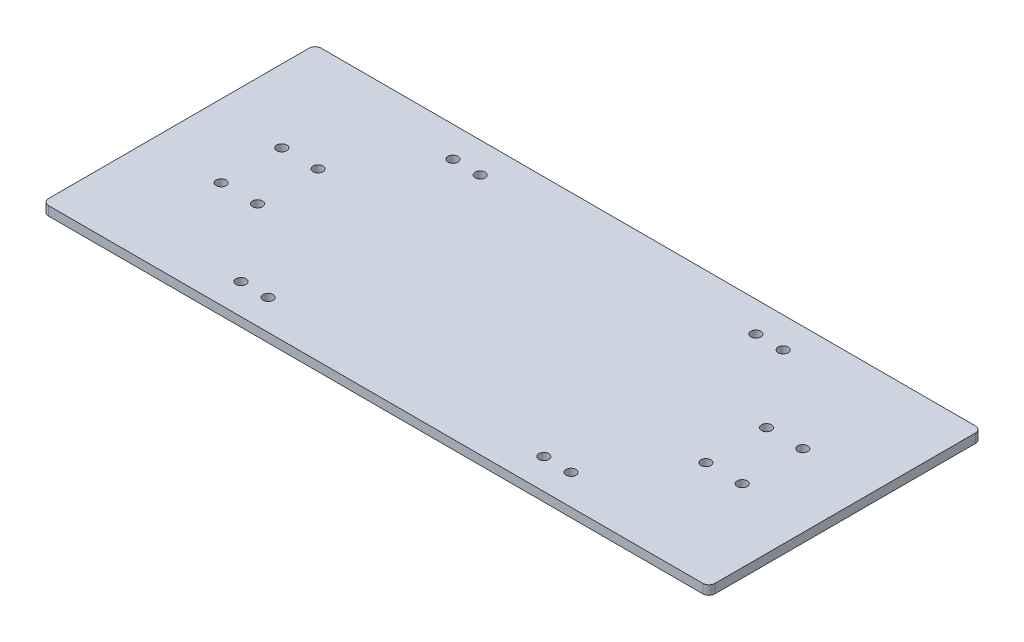
ISO-10303-21;
HEADER;
FILE_DESCRIPTION(('STEP AP214'),'2;1');
FILE_NAME('part.step','',(''),(''),'','','');
FILE_SCHEMA(('AUTOMOTIVE_DESIGN { 1 0 10303 214 1 1 1 1 }'));
ENDSEC;
DATA;
#1=APPLICATION_CONTEXT('core data for automotive mechanical design processes');
#2=APPLICATION_PROTOCOL_DEFINITION('international standard','automotive_design',2000,#1);
#3=PRODUCT_CONTEXT('',#1,'mechanical');
#4=PRODUCT('Part','Part','',(#3));
#5=PRODUCT_RELATED_PRODUCT_CATEGORY('part','',(#4));
#6=PRODUCT_DEFINITION_FORMATION('','',#4);
#7=PRODUCT_DEFINITION_CONTEXT('part definition',#1,'design');
#8=PRODUCT_DEFINITION('design','',#6,#7);
#9=PRODUCT_DEFINITION_SHAPE('','',#8);
#10=(LENGTH_UNIT() NAMED_UNIT(*) SI_UNIT(.MILLI.,.METRE.));
#11=(NAMED_UNIT(*) PLANE_ANGLE_UNIT() SI_UNIT($,.RADIAN.));
#12=(NAMED_UNIT(*) SI_UNIT($,.STERADIAN.) SOLID_ANGLE_UNIT());
#13=UNCERTAINTY_MEASURE_WITH_UNIT(LENGTH_MEASURE(1.E-05),#10,'distance_accuracy_value','');
#14=(GEOMETRIC_REPRESENTATION_CONTEXT(3) GLOBAL_UNCERTAINTY_ASSIGNED_CONTEXT((#13)) GLOBAL_UNIT_ASSIGNED_CONTEXT((#10,
#11,#12)) REPRESENTATION_CONTEXT('',''));
#15=CARTESIAN_POINT('',(0.,0.,0.));
#16=DIRECTION('',(0.,0.,1.));
#17=DIRECTION('',(1.,0.,0.));
#18=AXIS2_PLACEMENT_3D('',#15,#16,#17);
#19=CARTESIAN_POINT('',(110.,3.,45.));
#20=DIRECTION('',(-1.,0.,0.));
#21=DIRECTION('',(0.,0.,1.));
#22=AXIS2_PLACEMENT_3D('',#19,#20,#21);
#23=PLANE('',#22);
#24=DIRECTION('',(0.,0.,-1.));
#25=VECTOR('',#24,1.);
#26=CARTESIAN_POINT('',(110.,3.,45.));
#27=LINE('',#26,#25);
#28=CARTESIAN_POINT('',(110.,3.,43.));
#29=VERTEX_POINT('',#28);
#30=CARTESIAN_POINT('',(110.,3.,-43.));
#31=VERTEX_POINT('',#30);
#32=EDGE_CURVE('E132',#29,#31,#27,.T.);
#33=ORIENTED_EDGE('',*,*,#32,.F.);
#34=DIRECTION('',(0.,-1.,0.));
#35=VECTOR('',#34,1.);
#36=CARTESIAN_POINT('',(110.,3.,43.));
#37=LINE('',#36,#35);
#38=CARTESIAN_POINT('',(110.,0.,43.));
#39=VERTEX_POINT('',#38);
#40=EDGE_CURVE('E117',#29,#39,#37,.T.);
#41=ORIENTED_EDGE('',*,*,#40,.T.);
#42=DIRECTION('',(0.,0.,-1.));
#43=VECTOR('',#42,1.);
#44=CARTESIAN_POINT('',(110.,0.,45.));
#45=LINE('',#44,#43);
#46=CARTESIAN_POINT('',(110.,0.,-43.));
#47=VERTEX_POINT('',#46);
#48=EDGE_CURVE('E131',#39,#47,#45,.T.);
#49=ORIENTED_EDGE('',*,*,#48,.T.);
#50=DIRECTION('',(0.,-1.,0.));
#51=VECTOR('',#50,1.);
#52=CARTESIAN_POINT('',(110.,3.,-43.));
#53=LINE('',#52,#51);
#54=EDGE_CURVE('E140',#47,#31,#53,.F.);
#55=ORIENTED_EDGE('',*,*,#54,.T.);
#56=EDGE_LOOP('',(#33,#41,#49,#55));
#57=FACE_BOUND('',#56,.T.);
#58=ADVANCED_FACE('F44',(#57),#23,.F.);
#59=CARTESIAN_POINT('',(-110.,3.,-45.));
#60=DIRECTION('',(0.,0.,1.));
#61=DIRECTION('',(1.,0.,0.));
#62=AXIS2_PLACEMENT_3D('',#59,#60,#61);
#63=PLANE('',#62);
#64=DIRECTION('',(-1.,0.,0.));
#65=VECTOR('',#64,1.);
#66=CARTESIAN_POINT('',(-110.,0.,-45.));
#67=LINE('',#66,#65);
#68=CARTESIAN_POINT('',(108.,0.,-45.));
#69=VERTEX_POINT('',#68);
#70=CARTESIAN_POINT('',(-108.,0.,-45.));
#71=VERTEX_POINT('',#70);
#72=EDGE_CURVE('E141',#69,#71,#67,.T.);
#73=ORIENTED_EDGE('',*,*,#72,.T.);
#74=DIRECTION('',(0.,-1.,0.));
#75=VECTOR('',#74,1.);
#76=CARTESIAN_POINT('',(-108.,3.,-45.));
#77=LINE('',#76,#75);
#78=CARTESIAN_POINT('',(-108.,3.,-45.));
#79=VERTEX_POINT('',#78);
#80=EDGE_CURVE('E11',#71,#79,#77,.F.);
#81=ORIENTED_EDGE('',*,*,#80,.T.);
#82=DIRECTION('',(-1.,0.,0.));
#83=VECTOR('',#82,1.);
#84=CARTESIAN_POINT('',(-110.,3.,-45.));
#85=LINE('',#84,#83);
#86=CARTESIAN_POINT('',(108.,3.,-45.));
#87=VERTEX_POINT('',#86);
#88=EDGE_CURVE('E310',#87,#79,#85,.T.);
#89=ORIENTED_EDGE('',*,*,#88,.F.);
#90=DIRECTION('',(0.,-1.,0.));
#91=VECTOR('',#90,1.);
#92=CARTESIAN_POINT('',(108.,3.,-45.));
#93=LINE('',#92,#91);
#94=EDGE_CURVE('E54',#87,#69,#93,.T.);
#95=ORIENTED_EDGE('',*,*,#94,.T.);
#96=EDGE_LOOP('',(#73,#81,#89,#95));
#97=FACE_BOUND('',#96,.T.);
#98=ADVANCED_FACE('F330',(#97),#63,.F.);
#99=CARTESIAN_POINT('',(-110.,3.,45.));
#100=DIRECTION('',(1.,0.,0.));
#101=DIRECTION('',(0.,0.,-1.));
#102=AXIS2_PLACEMENT_3D('',#99,#100,#101);
#103=PLANE('',#102);
#104=DIRECTION('',(0.,0.,1.));
#105=VECTOR('',#104,1.);
#106=CARTESIAN_POINT('',(-110.,3.,45.));
#107=LINE('',#106,#105);
#108=CARTESIAN_POINT('',(-110.,3.,-43.));
#109=VERTEX_POINT('',#108);
#110=CARTESIAN_POINT('',(-110.,3.,43.));
#111=VERTEX_POINT('',#110);
#112=EDGE_CURVE('E307',#109,#111,#107,.T.);
#113=ORIENTED_EDGE('',*,*,#112,.F.);
#114=DIRECTION('',(0.,-1.,0.));
#115=VECTOR('',#114,1.);
#116=CARTESIAN_POINT('',(-110.,3.,-43.));
#117=LINE('',#116,#115);
#118=CARTESIAN_POINT('',(-110.,0.,-43.));
#119=VERTEX_POINT('',#118);
#120=EDGE_CURVE('E186',#109,#119,#117,.T.);
#121=ORIENTED_EDGE('',*,*,#120,.T.);
#122=DIRECTION('',(0.,0.,1.));
#123=VECTOR('',#122,1.);
#124=CARTESIAN_POINT('',(-110.,0.,45.));
#125=LINE('',#124,#123);
#126=CARTESIAN_POINT('',(-110.,0.,43.));
#127=VERTEX_POINT('',#126);
#128=EDGE_CURVE('E148',#119,#127,#125,.T.);
#129=ORIENTED_EDGE('',*,*,#128,.T.);
#130=DIRECTION('',(0.,-1.,0.));
#131=VECTOR('',#130,1.);
#132=CARTESIAN_POINT('',(-110.,3.,43.));
#133=LINE('',#132,#131);
#134=EDGE_CURVE('E65',#127,#111,#133,.F.);
#135=ORIENTED_EDGE('',*,*,#134,.T.);
#136=EDGE_LOOP('',(#113,#121,#129,#135));
#137=FACE_BOUND('',#136,.T.);
#138=ADVANCED_FACE('F324',(#137),#103,.F.);
#139=CARTESIAN_POINT('',(-110.,3.,45.));
#140=DIRECTION('',(0.,0.,-1.));
#141=DIRECTION('',(-1.,0.,0.));
#142=AXIS2_PLACEMENT_3D('',#139,#140,#141);
#143=PLANE('',#142);
#144=DIRECTION('',(1.,0.,0.));
#145=VECTOR('',#144,1.);
#146=CARTESIAN_POINT('',(-110.,0.,45.));
#147=LINE('',#146,#145);
#148=CARTESIAN_POINT('',(-108.,0.,45.));
#149=VERTEX_POINT('',#148);
#150=CARTESIAN_POINT('',(108.,0.,45.));
#151=VERTEX_POINT('',#150);
#152=EDGE_CURVE('E156',#149,#151,#147,.T.);
#153=ORIENTED_EDGE('',*,*,#152,.T.);
#154=DIRECTION('',(0.,-1.,0.));
#155=VECTOR('',#154,1.);
#156=CARTESIAN_POINT('',(108.,3.,45.));
#157=LINE('',#156,#155);
#158=CARTESIAN_POINT('',(108.,3.,45.));
#159=VERTEX_POINT('',#158);
#160=EDGE_CURVE('E118',#151,#159,#157,.F.);
#161=ORIENTED_EDGE('',*,*,#160,.T.);
#162=DIRECTION('',(1.,0.,0.));
#163=VECTOR('',#162,1.);
#164=CARTESIAN_POINT('',(-110.,3.,45.));
#165=LINE('',#164,#163);
#166=CARTESIAN_POINT('',(-108.,3.,45.));
#167=VERTEX_POINT('',#166);
#168=EDGE_CURVE('E154',#167,#159,#165,.T.);
#169=ORIENTED_EDGE('',*,*,#168,.F.);
#170=DIRECTION('',(0.,-1.,0.));
#171=VECTOR('',#170,1.);
#172=CARTESIAN_POINT('',(-108.,3.,45.));
#173=LINE('',#172,#171);
#174=EDGE_CURVE('E123',#167,#149,#173,.T.);
#175=ORIENTED_EDGE('',*,*,#174,.T.);
#176=EDGE_LOOP('',(#153,#161,#169,#175));
#177=FACE_BOUND('',#176,.T.);
#178=ADVANCED_FACE('F319',(#177),#143,.F.);
#179=CARTESIAN_POINT('',(0.,3.,0.));
#180=DIRECTION('',(0.,-1.,0.));
#181=DIRECTION('',(0.,0.,-1.));
#182=AXIS2_PLACEMENT_3D('',#179,#180,#181);
#183=PLANE('',#182);
#184=CARTESIAN_POINT('',(-86.,3.,10.));
#185=DIRECTION('',(0.,-1.,0.));
#186=DIRECTION('',(0.,0.,1.));
#187=AXIS2_PLACEMENT_3D('',#184,#185,#186);
#188=CIRCLE('',#187,1.65);
#189=CARTESIAN_POINT('',(-86.,3.,11.65));
#190=VERTEX_POINT('',#189);
#191=EDGE_CURVE('E570',#190,#190,#188,.T.);
#192=ORIENTED_EDGE('',*,*,#191,.T.);
#193=EDGE_LOOP('',(#192));
#194=FACE_BOUND('',#193,.T.);
#195=CARTESIAN_POINT('',(-74.,3.,10.));
#196=DIRECTION('',(0.,-1.,0.));
#197=DIRECTION('',(0.,0.,1.));
#198=AXIS2_PLACEMENT_3D('',#195,#196,#197);
#199=CIRCLE('',#198,1.65);
#200=CARTESIAN_POINT('',(-74.,3.,11.65));
#201=VERTEX_POINT('',#200);
#202=EDGE_CURVE('E567',#201,#201,#199,.T.);
#203=ORIENTED_EDGE('',*,*,#202,.T.);
#204=EDGE_LOOP('',(#203));
#205=FACE_BOUND('',#204,.T.);
#206=CARTESIAN_POINT('',(-74.,3.,-10.));
#207=DIRECTION('',(0.,-1.,0.));
#208=DIRECTION('',(0.,0.,1.));
#209=AXIS2_PLACEMENT_3D('',#206,#207,#208);
#210=CIRCLE('',#209,1.65);
#211=CARTESIAN_POINT('',(-74.,3.,-8.35));
#212=VERTEX_POINT('',#211);
#213=EDGE_CURVE('E572',#212,#212,#210,.T.);
#214=ORIENTED_EDGE('',*,*,#213,.T.);
#215=EDGE_LOOP('',(#214));
#216=FACE_BOUND('',#215,.T.);
#217=CARTESIAN_POINT('',(-86.,3.,-10.));
#218=DIRECTION('',(0.,-1.,0.));
#219=DIRECTION('',(0.,0.,1.));
#220=AXIS2_PLACEMENT_3D('',#217,#218,#219);
#221=CIRCLE('',#220,1.65);
#222=CARTESIAN_POINT('',(-86.,3.,-8.35));
#223=VERTEX_POINT('',#222);
#224=EDGE_CURVE('E217',#223,#223,#221,.T.);
#225=ORIENTED_EDGE('',*,*,#224,.T.);
#226=EDGE_LOOP('',(#225));
#227=FACE_BOUND('',#226,.T.);
#228=CARTESIAN_POINT('',(86.,3.,10.));
#229=DIRECTION('',(0.,1.,0.));
#230=DIRECTION('',(0.,0.,1.));
#231=AXIS2_PLACEMENT_3D('',#228,#229,#230);
#232=CIRCLE('',#231,1.65);
#233=CARTESIAN_POINT('',(86.,3.,11.65));
#234=VERTEX_POINT('',#233);
#235=EDGE_CURVE('E230',#234,#234,#232,.T.);
#236=ORIENTED_EDGE('',*,*,#235,.F.);
#237=EDGE_LOOP('',(#236));
#238=FACE_BOUND('',#237,.T.);
#239=CARTESIAN_POINT('',(74.,3.,10.));
#240=DIRECTION('',(0.,1.,0.));
#241=DIRECTION('',(0.,0.,1.));
#242=AXIS2_PLACEMENT_3D('',#239,#240,#241);
#243=CIRCLE('',#242,1.65);
#244=CARTESIAN_POINT('',(74.,3.,11.65));
#245=VERTEX_POINT('',#244);
#246=EDGE_CURVE('E234',#245,#245,#243,.T.);
#247=ORIENTED_EDGE('',*,*,#246,.F.);
#248=EDGE_LOOP('',(#247));
#249=FACE_BOUND('',#248,.T.);
#250=CARTESIAN_POINT('',(74.,3.,-10.));
#251=DIRECTION('',(0.,1.,0.));
#252=DIRECTION('',(0.,0.,1.));
#253=AXIS2_PLACEMENT_3D('',#250,#251,#252);
#254=CIRCLE('',#253,1.65);
#255=CARTESIAN_POINT('',(74.,3.,-8.35));
#256=VERTEX_POINT('',#255);
#257=EDGE_CURVE('E239',#256,#256,#254,.T.);
#258=ORIENTED_EDGE('',*,*,#257,.F.);
#259=EDGE_LOOP('',(#258));
#260=FACE_BOUND('',#259,.T.);
#261=CARTESIAN_POINT('',(86.,3.,-10.));
#262=DIRECTION('',(0.,1.,0.));
#263=DIRECTION('',(0.,0.,1.));
#264=AXIS2_PLACEMENT_3D('',#261,#262,#263);
#265=CIRCLE('',#264,1.65);
#266=CARTESIAN_POINT('',(86.,3.,-8.35));
#267=VERTEX_POINT('',#266);
#268=EDGE_CURVE('E202',#267,#267,#265,.T.);
#269=ORIENTED_EDGE('',*,*,#268,.F.);
#270=EDGE_LOOP('',(#269));
#271=FACE_BOUND('',#270,.T.);
#272=CARTESIAN_POINT('',(54.5,3.,35.));
#273=DIRECTION('',(0.,-1.,0.));
#274=DIRECTION('',(0.,0.,-1.));
#275=AXIS2_PLACEMENT_3D('',#272,#273,#274);
#276=CIRCLE('',#275,1.65);
#277=CARTESIAN_POINT('',(54.5,3.,33.35));
#278=VERTEX_POINT('',#277);
#279=EDGE_CURVE('E255',#278,#278,#276,.T.);
#280=ORIENTED_EDGE('',*,*,#279,.T.);
#281=EDGE_LOOP('',(#280));
#282=FACE_BOUND('',#281,.T.);
#283=CARTESIAN_POINT('',(-45.5,3.,35.));
#284=DIRECTION('',(0.,-1.,0.));
#285=DIRECTION('',(0.,0.,1.));
#286=AXIS2_PLACEMENT_3D('',#283,#284,#285);
#287=CIRCLE('',#286,1.65);
#288=CARTESIAN_POINT('',(-45.5,3.,36.65));
#289=VERTEX_POINT('',#288);
#290=EDGE_CURVE('E215',#289,#289,#287,.T.);
#291=ORIENTED_EDGE('',*,*,#290,.T.);
#292=EDGE_LOOP('',(#291));
#293=FACE_BOUND('',#292,.T.);
#294=CARTESIAN_POINT('',(-54.5,3.,35.));
#295=DIRECTION('',(0.,-1.,0.));
#296=DIRECTION('',(0.,0.,1.));
#297=AXIS2_PLACEMENT_3D('',#294,#295,#296);
#298=CIRCLE('',#297,1.65);
#299=CARTESIAN_POINT('',(-54.5,3.,36.65));
#300=VERTEX_POINT('',#299);
#301=EDGE_CURVE('E261',#300,#300,#298,.T.);
#302=ORIENTED_EDGE('',*,*,#301,.T.);
#303=EDGE_LOOP('',(#302));
#304=FACE_BOUND('',#303,.T.);
#305=CARTESIAN_POINT('',(45.5,3.,35.));
#306=DIRECTION('',(0.,-1.,0.));
#307=DIRECTION('',(0.,0.,-1.));
#308=AXIS2_PLACEMENT_3D('',#305,#306,#307);
#309=CIRCLE('',#308,1.65);
#310=CARTESIAN_POINT('',(45.5,3.,33.35));
#311=VERTEX_POINT('',#310);
#312=EDGE_CURVE('E268',#311,#311,#309,.T.);
#313=ORIENTED_EDGE('',*,*,#312,.T.);
#314=EDGE_LOOP('',(#313));
#315=FACE_BOUND('',#314,.T.);
#316=CARTESIAN_POINT('',(54.5,3.,-35.));
#317=DIRECTION('',(0.,1.,0.));
#318=DIRECTION('',(0.,0.,1.));
#319=AXIS2_PLACEMENT_3D('',#316,#317,#318);
#320=CIRCLE('',#319,1.65);
#321=CARTESIAN_POINT('',(54.5,3.,-33.35));
#322=VERTEX_POINT('',#321);
#323=EDGE_CURVE('E155',#322,#322,#320,.T.);
#324=ORIENTED_EDGE('',*,*,#323,.F.);
#325=EDGE_LOOP('',(#324));
#326=FACE_BOUND('',#325,.T.);
#327=CARTESIAN_POINT('',(-45.5,3.,-35.));
#328=DIRECTION('',(0.,1.,0.));
#329=DIRECTION('',(0.,0.,-1.));
#330=AXIS2_PLACEMENT_3D('',#327,#328,#329);
#331=CIRCLE('',#330,1.65);
#332=CARTESIAN_POINT('',(-45.5,3.,-36.65));
#333=VERTEX_POINT('',#332);
#334=EDGE_CURVE('E283',#333,#333,#331,.T.);
#335=ORIENTED_EDGE('',*,*,#334,.F.);
#336=EDGE_LOOP('',(#335));
#337=FACE_BOUND('',#336,.T.);
#338=CARTESIAN_POINT('',(-54.5,3.,-35.));
#339=DIRECTION('',(0.,1.,0.));
#340=DIRECTION('',(0.,0.,-1.));
#341=AXIS2_PLACEMENT_3D('',#338,#339,#340);
#342=CIRCLE('',#341,1.65);
#343=CARTESIAN_POINT('',(-54.5,3.,-36.65));
#344=VERTEX_POINT('',#343);
#345=EDGE_CURVE('E296',#344,#344,#342,.T.);
#346=ORIENTED_EDGE('',*,*,#345,.F.);
#347=EDGE_LOOP('',(#346));
#348=FACE_BOUND('',#347,.T.);
#349=CARTESIAN_POINT('',(45.5,3.,-35.));
#350=DIRECTION('',(0.,1.,0.));
#351=DIRECTION('',(0.,0.,1.));
#352=AXIS2_PLACEMENT_3D('',#349,#350,#351);
#353=CIRCLE('',#352,1.65);
#354=CARTESIAN_POINT('',(45.5,3.,-33.35));
#355=VERTEX_POINT('',#354);
#356=EDGE_CURVE('E285',#355,#355,#353,.T.);
#357=ORIENTED_EDGE('',*,*,#356,.F.);
#358=EDGE_LOOP('',(#357));
#359=FACE_BOUND('',#358,.T.);
#360=ORIENTED_EDGE('',*,*,#168,.T.);
#361=CARTESIAN_POINT('',(108.,3.,43.));
#362=DIRECTION('',(0.,-1.,0.));
#363=DIRECTION('',(0.,0.,-1.));
#364=AXIS2_PLACEMENT_3D('',#361,#362,#363);
#365=CIRCLE('',#364,2.);
#366=EDGE_CURVE('E183',#159,#29,#365,.F.);
#367=ORIENTED_EDGE('',*,*,#366,.T.);
#368=ORIENTED_EDGE('',*,*,#32,.T.);
#369=CARTESIAN_POINT('',(108.,3.,-43.));
#370=DIRECTION('',(0.,-1.,0.));
#371=DIRECTION('',(0.,0.,-1.));
#372=AXIS2_PLACEMENT_3D('',#369,#370,#371);
#373=CIRCLE('',#372,2.);
#374=EDGE_CURVE('E177',#31,#87,#373,.F.);
#375=ORIENTED_EDGE('',*,*,#374,.T.);
#376=ORIENTED_EDGE('',*,*,#88,.T.);
#377=CARTESIAN_POINT('',(-108.,3.,-43.));
#378=DIRECTION('',(0.,-1.,0.));
#379=DIRECTION('',(0.,0.,-1.));
#380=AXIS2_PLACEMENT_3D('',#377,#378,#379);
#381=CIRCLE('',#380,2.);
#382=EDGE_CURVE('E69',#79,#109,#381,.F.);
#383=ORIENTED_EDGE('',*,*,#382,.T.);
#384=ORIENTED_EDGE('',*,*,#112,.T.);
#385=CARTESIAN_POINT('',(-108.,3.,43.));
#386=DIRECTION('',(0.,-1.,0.));
#387=DIRECTION('',(0.,0.,-1.));
#388=AXIS2_PLACEMENT_3D('',#385,#386,#387);
#389=CIRCLE('',#388,2.);
#390=EDGE_CURVE('E176',#111,#167,#389,.F.);
#391=ORIENTED_EDGE('',*,*,#390,.T.);
#392=EDGE_LOOP('',(#360,#367,#368,#375,#376,#383,#384,#391));
#393=FACE_BOUND('',#392,.T.);
#394=ADVANCED_FACE('F314',(#194,#205,#216,#227,#238,#249,#260,#271,#282,#293,#304,#315,#326,
#337,#348,#359,#393),#183,.F.);
#395=CARTESIAN_POINT('',(0.,0.,0.));
#396=DIRECTION('',(0.,-1.,0.));
#397=DIRECTION('',(0.,0.,-1.));
#398=AXIS2_PLACEMENT_3D('',#395,#396,#397);
#399=PLANE('',#398);
#400=CARTESIAN_POINT('',(-86.,0.,10.));
#401=DIRECTION('',(0.,-1.,0.));
#402=DIRECTION('',(0.,0.,-1.));
#403=AXIS2_PLACEMENT_3D('',#400,#401,#402);
#404=CIRCLE('',#403,1.65);
#405=CARTESIAN_POINT('',(-86.,0.,8.35));
#406=VERTEX_POINT('',#405);
#407=EDGE_CURVE('E47',#406,#406,#404,.F.);
#408=ORIENTED_EDGE('',*,*,#407,.T.);
#409=EDGE_LOOP('',(#408));
#410=FACE_BOUND('',#409,.T.);
#411=CARTESIAN_POINT('',(-74.,0.,10.));
#412=DIRECTION('',(0.,-1.,0.));
#413=DIRECTION('',(0.,0.,-1.));
#414=AXIS2_PLACEMENT_3D('',#411,#412,#413);
#415=CIRCLE('',#414,1.65);
#416=CARTESIAN_POINT('',(-74.,0.,8.35));
#417=VERTEX_POINT('',#416);
#418=EDGE_CURVE('E225',#417,#417,#415,.F.);
#419=ORIENTED_EDGE('',*,*,#418,.T.);
#420=EDGE_LOOP('',(#419));
#421=FACE_BOUND('',#420,.T.);
#422=CARTESIAN_POINT('',(-74.,0.,-10.));
#423=DIRECTION('',(0.,-1.,0.));
#424=DIRECTION('',(0.,0.,-1.));
#425=AXIS2_PLACEMENT_3D('',#422,#423,#424);
#426=CIRCLE('',#425,1.65);
#427=CARTESIAN_POINT('',(-74.,0.,-11.65));
#428=VERTEX_POINT('',#427);
#429=EDGE_CURVE('E218',#428,#428,#426,.F.);
#430=ORIENTED_EDGE('',*,*,#429,.T.);
#431=EDGE_LOOP('',(#430));
#432=FACE_BOUND('',#431,.T.);
#433=CARTESIAN_POINT('',(-86.,0.,-10.));
#434=DIRECTION('',(0.,-1.,0.));
#435=DIRECTION('',(0.,0.,-1.));
#436=AXIS2_PLACEMENT_3D('',#433,#434,#435);
#437=CIRCLE('',#436,1.65);
#438=CARTESIAN_POINT('',(-86.,0.,-11.65));
#439=VERTEX_POINT('',#438);
#440=EDGE_CURVE('E213',#439,#439,#437,.F.);
#441=ORIENTED_EDGE('',*,*,#440,.T.);
#442=EDGE_LOOP('',(#441));
#443=FACE_BOUND('',#442,.T.);
#444=CARTESIAN_POINT('',(86.,0.,10.));
#445=DIRECTION('',(0.,-1.,0.));
#446=DIRECTION('',(0.,0.,-1.));
#447=AXIS2_PLACEMENT_3D('',#444,#445,#446);
#448=CIRCLE('',#447,1.65);
#449=CARTESIAN_POINT('',(86.,0.,8.35));
#450=VERTEX_POINT('',#449);
#451=EDGE_CURVE('E209',#450,#450,#448,.T.);
#452=ORIENTED_EDGE('',*,*,#451,.F.);
#453=EDGE_LOOP('',(#452));
#454=FACE_BOUND('',#453,.T.);
#455=CARTESIAN_POINT('',(74.,0.,10.));
#456=DIRECTION('',(0.,-1.,0.));
#457=DIRECTION('',(0.,0.,-1.));
#458=AXIS2_PLACEMENT_3D('',#455,#456,#457);
#459=CIRCLE('',#458,1.65);
#460=CARTESIAN_POINT('',(74.,0.,8.35));
#461=VERTEX_POINT('',#460);
#462=EDGE_CURVE('E201',#461,#461,#459,.T.);
#463=ORIENTED_EDGE('',*,*,#462,.F.);
#464=EDGE_LOOP('',(#463));
#465=FACE_BOUND('',#464,.T.);
#466=CARTESIAN_POINT('',(74.,0.,-10.));
#467=DIRECTION('',(0.,-1.,0.));
#468=DIRECTION('',(0.,0.,-1.));
#469=AXIS2_PLACEMENT_3D('',#466,#467,#468);
#470=CIRCLE('',#469,1.65);
#471=CARTESIAN_POINT('',(74.,0.,-11.65));
#472=VERTEX_POINT('',#471);
#473=EDGE_CURVE('E199',#472,#472,#470,.T.);
#474=ORIENTED_EDGE('',*,*,#473,.F.);
#475=EDGE_LOOP('',(#474));
#476=FACE_BOUND('',#475,.T.);
#477=CARTESIAN_POINT('',(86.,0.,-10.));
#478=DIRECTION('',(0.,-1.,0.));
#479=DIRECTION('',(0.,0.,-1.));
#480=AXIS2_PLACEMENT_3D('',#477,#478,#479);
#481=CIRCLE('',#480,1.65);
#482=CARTESIAN_POINT('',(86.,0.,-11.65));
#483=VERTEX_POINT('',#482);
#484=EDGE_CURVE('E196',#483,#483,#481,.T.);
#485=ORIENTED_EDGE('',*,*,#484,.F.);
#486=EDGE_LOOP('',(#485));
#487=FACE_BOUND('',#486,.T.);
#488=CARTESIAN_POINT('',(54.5,0.,35.));
#489=DIRECTION('',(0.,-1.,0.));
#490=DIRECTION('',(0.,0.,-1.));
#491=AXIS2_PLACEMENT_3D('',#488,#489,#490);
#492=CIRCLE('',#491,1.65);
#493=CARTESIAN_POINT('',(54.5,0.,33.35));
#494=VERTEX_POINT('',#493);
#495=EDGE_CURVE('E250',#494,#494,#492,.T.);
#496=ORIENTED_EDGE('',*,*,#495,.F.);
#497=EDGE_LOOP('',(#496));
#498=FACE_BOUND('',#497,.T.);
#499=CARTESIAN_POINT('',(-45.5,0.,35.));
#500=DIRECTION('',(0.,-1.,0.));
#501=DIRECTION('',(0.,0.,1.));
#502=AXIS2_PLACEMENT_3D('',#499,#500,#501);
#503=CIRCLE('',#502,1.65);
#504=CARTESIAN_POINT('',(-45.5,0.,36.65));
#505=VERTEX_POINT('',#504);
#506=EDGE_CURVE('E256',#505,#505,#503,.T.);
#507=ORIENTED_EDGE('',*,*,#506,.F.);
#508=EDGE_LOOP('',(#507));
#509=FACE_BOUND('',#508,.T.);
#510=CARTESIAN_POINT('',(-54.5,0.,35.));
#511=DIRECTION('',(0.,-1.,0.));
#512=DIRECTION('',(0.,0.,1.));
#513=AXIS2_PLACEMENT_3D('',#510,#511,#512);
#514=CIRCLE('',#513,1.65);
#515=CARTESIAN_POINT('',(-54.5,0.,36.65));
#516=VERTEX_POINT('',#515);
#517=EDGE_CURVE('E275',#516,#516,#514,.T.);
#518=ORIENTED_EDGE('',*,*,#517,.F.);
#519=EDGE_LOOP('',(#518));
#520=FACE_BOUND('',#519,.T.);
#521=CARTESIAN_POINT('',(45.5,0.,35.));
#522=DIRECTION('',(0.,-1.,0.));
#523=DIRECTION('',(0.,0.,-1.));
#524=AXIS2_PLACEMENT_3D('',#521,#522,#523);
#525=CIRCLE('',#524,1.65);
#526=CARTESIAN_POINT('',(45.5,0.,33.35));
#527=VERTEX_POINT('',#526);
#528=EDGE_CURVE('E259',#527,#527,#525,.T.);
#529=ORIENTED_EDGE('',*,*,#528,.F.);
#530=EDGE_LOOP('',(#529));
#531=FACE_BOUND('',#530,.T.);
#532=CARTESIAN_POINT('',(54.5,0.,-35.));
#533=DIRECTION('',(0.,1.,0.));
#534=DIRECTION('',(0.,0.,1.));
#535=AXIS2_PLACEMENT_3D('',#532,#533,#534);
#536=CIRCLE('',#535,1.65);
#537=CARTESIAN_POINT('',(54.5,0.,-33.35));
#538=VERTEX_POINT('',#537);
#539=EDGE_CURVE('E144',#538,#538,#536,.T.);
#540=ORIENTED_EDGE('',*,*,#539,.T.);
#541=EDGE_LOOP('',(#540));
#542=FACE_BOUND('',#541,.T.);
#543=CARTESIAN_POINT('',(-45.5,0.,-35.));
#544=DIRECTION('',(0.,1.,0.));
#545=DIRECTION('',(0.,0.,-1.));
#546=AXIS2_PLACEMENT_3D('',#543,#544,#545);
#547=CIRCLE('',#546,1.65);
#548=CARTESIAN_POINT('',(-45.5,0.,-36.65));
#549=VERTEX_POINT('',#548);
#550=EDGE_CURVE('E252',#549,#549,#547,.T.);
#551=ORIENTED_EDGE('',*,*,#550,.T.);
#552=EDGE_LOOP('',(#551));
#553=FACE_BOUND('',#552,.T.);
#554=CARTESIAN_POINT('',(-54.5,0.,-35.));
#555=DIRECTION('',(0.,1.,0.));
#556=DIRECTION('',(0.,0.,-1.));
#557=AXIS2_PLACEMENT_3D('',#554,#555,#556);
#558=CIRCLE('',#557,1.65);
#559=CARTESIAN_POINT('',(-54.5,0.,-36.65));
#560=VERTEX_POINT('',#559);
#561=EDGE_CURVE('E290',#560,#560,#558,.T.);
#562=ORIENTED_EDGE('',*,*,#561,.T.);
#563=EDGE_LOOP('',(#562));
#564=FACE_BOUND('',#563,.T.);
#565=CARTESIAN_POINT('',(45.5,0.,-35.));
#566=DIRECTION('',(0.,1.,0.));
#567=DIRECTION('',(0.,0.,1.));
#568=AXIS2_PLACEMENT_3D('',#565,#566,#567);
#569=CIRCLE('',#568,1.65);
#570=CARTESIAN_POINT('',(45.5,0.,-33.35));
#571=VERTEX_POINT('',#570);
#572=EDGE_CURVE('E295',#571,#571,#569,.T.);
#573=ORIENTED_EDGE('',*,*,#572,.T.);
#574=EDGE_LOOP('',(#573));
#575=FACE_BOUND('',#574,.T.);
#576=ORIENTED_EDGE('',*,*,#48,.F.);
#577=CARTESIAN_POINT('',(108.,0.,43.));
#578=DIRECTION('',(0.,-1.,0.));
#579=DIRECTION('',(0.,0.,-1.));
#580=AXIS2_PLACEMENT_3D('',#577,#578,#579);
#581=CIRCLE('',#580,2.);
#582=EDGE_CURVE('E112',#39,#151,#581,.T.);
#583=ORIENTED_EDGE('',*,*,#582,.T.);
#584=ORIENTED_EDGE('',*,*,#152,.F.);
#585=CARTESIAN_POINT('',(-108.,0.,43.));
#586=DIRECTION('',(0.,-1.,0.));
#587=DIRECTION('',(0.,0.,-1.));
#588=AXIS2_PLACEMENT_3D('',#585,#586,#587);
#589=CIRCLE('',#588,2.);
#590=EDGE_CURVE('E137',#149,#127,#589,.T.);
#591=ORIENTED_EDGE('',*,*,#590,.T.);
#592=ORIENTED_EDGE('',*,*,#128,.F.);
#593=CARTESIAN_POINT('',(-108.,0.,-43.));
#594=DIRECTION('',(0.,-1.,0.));
#595=DIRECTION('',(0.,0.,-1.));
#596=AXIS2_PLACEMENT_3D('',#593,#594,#595);
#597=CIRCLE('',#596,2.);
#598=EDGE_CURVE('E129',#119,#71,#597,.T.);
#599=ORIENTED_EDGE('',*,*,#598,.T.);
#600=ORIENTED_EDGE('',*,*,#72,.F.);
#601=CARTESIAN_POINT('',(108.,0.,-43.));
#602=DIRECTION('',(0.,-1.,0.));
#603=DIRECTION('',(0.,0.,-1.));
#604=AXIS2_PLACEMENT_3D('',#601,#602,#603);
#605=CIRCLE('',#604,2.);
#606=EDGE_CURVE('E142',#69,#47,#605,.T.);
#607=ORIENTED_EDGE('',*,*,#606,.T.);
#608=EDGE_LOOP('',(#576,#583,#584,#591,#592,#599,#600,#607));
#609=FACE_BOUND('',#608,.T.);
#610=ADVANCED_FACE('F139',(#410,#421,#432,#443,#454,#465,#476,#487,#498,#509,#520,#531,#542,
#553,#564,#575,#609),#399,.T.);
#611=CARTESIAN_POINT('',(45.5,0.,-35.));
#612=DIRECTION('',(0.,1.,0.));
#613=DIRECTION('',(0.,0.,1.));
#614=AXIS2_PLACEMENT_3D('',#611,#612,#613);
#615=CYLINDRICAL_SURFACE('',#614,1.65);
#616=ORIENTED_EDGE('',*,*,#572,.F.);
#617=EDGE_LOOP('',(#616));
#618=FACE_BOUND('',#617,.T.);
#619=ORIENTED_EDGE('',*,*,#356,.T.);
#620=EDGE_LOOP('',(#619));
#621=FACE_BOUND('',#620,.T.);
#622=ADVANCED_FACE('F384',(#618,#621),#615,.F.);
#623=CARTESIAN_POINT('',(-54.5,0.,-35.));
#624=DIRECTION('',(0.,1.,0.));
#625=DIRECTION('',(0.,0.,1.));
#626=AXIS2_PLACEMENT_3D('',#623,#624,#625);
#627=CYLINDRICAL_SURFACE('',#626,1.65);
#628=ORIENTED_EDGE('',*,*,#561,.F.);
#629=EDGE_LOOP('',(#628));
#630=FACE_BOUND('',#629,.T.);
#631=ORIENTED_EDGE('',*,*,#345,.T.);
#632=EDGE_LOOP('',(#631));
#633=FACE_BOUND('',#632,.T.);
#634=ADVANCED_FACE('F382',(#630,#633),#627,.F.);
#635=CARTESIAN_POINT('',(-45.5,0.,-35.));
#636=DIRECTION('',(0.,1.,0.));
#637=DIRECTION('',(0.,0.,1.));
#638=AXIS2_PLACEMENT_3D('',#635,#636,#637);
#639=CYLINDRICAL_SURFACE('',#638,1.65);
#640=ORIENTED_EDGE('',*,*,#550,.F.);
#641=EDGE_LOOP('',(#640));
#642=FACE_BOUND('',#641,.T.);
#643=ORIENTED_EDGE('',*,*,#334,.T.);
#644=EDGE_LOOP('',(#643));
#645=FACE_BOUND('',#644,.T.);
#646=ADVANCED_FACE('F380',(#642,#645),#639,.F.);
#647=CARTESIAN_POINT('',(54.5,0.,-35.));
#648=DIRECTION('',(0.,1.,0.));
#649=DIRECTION('',(0.,0.,1.));
#650=AXIS2_PLACEMENT_3D('',#647,#648,#649);
#651=CYLINDRICAL_SURFACE('',#650,1.65);
#652=ORIENTED_EDGE('',*,*,#539,.F.);
#653=EDGE_LOOP('',(#652));
#654=FACE_BOUND('',#653,.T.);
#655=ORIENTED_EDGE('',*,*,#323,.T.);
#656=EDGE_LOOP('',(#655));
#657=FACE_BOUND('',#656,.T.);
#658=ADVANCED_FACE('F369',(#654,#657),#651,.F.);
#659=CARTESIAN_POINT('',(45.5,0.,35.));
#660=DIRECTION('',(0.,1.,0.));
#661=DIRECTION('',(0.,0.,1.));
#662=AXIS2_PLACEMENT_3D('',#659,#660,#661);
#663=CYLINDRICAL_SURFACE('',#662,1.65);
#664=ORIENTED_EDGE('',*,*,#528,.T.);
#665=EDGE_LOOP('',(#664));
#666=FACE_BOUND('',#665,.T.);
#667=ORIENTED_EDGE('',*,*,#312,.F.);
#668=EDGE_LOOP('',(#667));
#669=FACE_BOUND('',#668,.T.);
#670=ADVANCED_FACE('F370',(#666,#669),#663,.F.);
#671=CARTESIAN_POINT('',(-54.5,0.,35.));
#672=DIRECTION('',(0.,1.,0.));
#673=DIRECTION('',(0.,0.,1.));
#674=AXIS2_PLACEMENT_3D('',#671,#672,#673);
#675=CYLINDRICAL_SURFACE('',#674,1.65);
#676=ORIENTED_EDGE('',*,*,#517,.T.);
#677=EDGE_LOOP('',(#676));
#678=FACE_BOUND('',#677,.T.);
#679=ORIENTED_EDGE('',*,*,#301,.F.);
#680=EDGE_LOOP('',(#679));
#681=FACE_BOUND('',#680,.T.);
#682=ADVANCED_FACE('F359',(#678,#681),#675,.F.);
#683=CARTESIAN_POINT('',(-45.5,0.,35.));
#684=DIRECTION('',(0.,1.,0.));
#685=DIRECTION('',(0.,0.,1.));
#686=AXIS2_PLACEMENT_3D('',#683,#684,#685);
#687=CYLINDRICAL_SURFACE('',#686,1.65);
#688=ORIENTED_EDGE('',*,*,#506,.T.);
#689=EDGE_LOOP('',(#688));
#690=FACE_BOUND('',#689,.T.);
#691=ORIENTED_EDGE('',*,*,#290,.F.);
#692=EDGE_LOOP('',(#691));
#693=FACE_BOUND('',#692,.T.);
#694=ADVANCED_FACE('F354',(#690,#693),#687,.F.);
#695=CARTESIAN_POINT('',(54.5,0.,35.));
#696=DIRECTION('',(0.,1.,0.));
#697=DIRECTION('',(0.,0.,1.));
#698=AXIS2_PLACEMENT_3D('',#695,#696,#697);
#699=CYLINDRICAL_SURFACE('',#698,1.65);
#700=ORIENTED_EDGE('',*,*,#495,.T.);
#701=EDGE_LOOP('',(#700));
#702=FACE_BOUND('',#701,.T.);
#703=ORIENTED_EDGE('',*,*,#279,.F.);
#704=EDGE_LOOP('',(#703));
#705=FACE_BOUND('',#704,.T.);
#706=ADVANCED_FACE('F349',(#702,#705),#699,.F.);
#707=CARTESIAN_POINT('',(108.,3.,43.));
#708=DIRECTION('',(0.,-1.,0.));
#709=DIRECTION('',(0.,0.,-1.));
#710=AXIS2_PLACEMENT_3D('',#707,#708,#709);
#711=CYLINDRICAL_SURFACE('',#710,2.);
#712=ORIENTED_EDGE('',*,*,#366,.F.);
#713=ORIENTED_EDGE('',*,*,#160,.F.);
#714=ORIENTED_EDGE('',*,*,#582,.F.);
#715=ORIENTED_EDGE('',*,*,#40,.F.);
#716=EDGE_LOOP('',(#712,#713,#714,#715));
#717=FACE_BOUND('',#716,.T.);
#718=ADVANCED_FACE('F120',(#717),#711,.T.);
#719=CARTESIAN_POINT('',(-108.,3.,-43.));
#720=DIRECTION('',(0.,-1.,0.));
#721=DIRECTION('',(0.,0.,-1.));
#722=AXIS2_PLACEMENT_3D('',#719,#720,#721);
#723=CYLINDRICAL_SURFACE('',#722,2.);
#724=ORIENTED_EDGE('',*,*,#382,.F.);
#725=ORIENTED_EDGE('',*,*,#80,.F.);
#726=ORIENTED_EDGE('',*,*,#598,.F.);
#727=ORIENTED_EDGE('',*,*,#120,.F.);
#728=EDGE_LOOP('',(#724,#725,#726,#727));
#729=FACE_BOUND('',#728,.T.);
#730=ADVANCED_FACE('F323',(#729),#723,.T.);
#731=CARTESIAN_POINT('',(108.,3.,-43.));
#732=DIRECTION('',(0.,-1.,0.));
#733=DIRECTION('',(0.,0.,-1.));
#734=AXIS2_PLACEMENT_3D('',#731,#732,#733);
#735=CYLINDRICAL_SURFACE('',#734,2.);
#736=ORIENTED_EDGE('',*,*,#374,.F.);
#737=ORIENTED_EDGE('',*,*,#54,.F.);
#738=ORIENTED_EDGE('',*,*,#606,.F.);
#739=ORIENTED_EDGE('',*,*,#94,.F.);
#740=EDGE_LOOP('',(#736,#737,#738,#739));
#741=FACE_BOUND('',#740,.T.);
#742=ADVANCED_FACE('F335',(#741),#735,.T.);
#743=CARTESIAN_POINT('',(-108.,3.,43.));
#744=DIRECTION('',(0.,-1.,0.));
#745=DIRECTION('',(0.,0.,-1.));
#746=AXIS2_PLACEMENT_3D('',#743,#744,#745);
#747=CYLINDRICAL_SURFACE('',#746,2.);
#748=ORIENTED_EDGE('',*,*,#390,.F.);
#749=ORIENTED_EDGE('',*,*,#134,.F.);
#750=ORIENTED_EDGE('',*,*,#590,.F.);
#751=ORIENTED_EDGE('',*,*,#174,.F.);
#752=EDGE_LOOP('',(#748,#749,#750,#751));
#753=FACE_BOUND('',#752,.T.);
#754=ADVANCED_FACE('F50',(#753),#747,.T.);
#755=CARTESIAN_POINT('',(86.,-7.,-10.));
#756=DIRECTION('',(0.,1.,0.));
#757=DIRECTION('',(0.,0.,1.));
#758=AXIS2_PLACEMENT_3D('',#755,#756,#757);
#759=CYLINDRICAL_SURFACE('',#758,1.65);
#760=ORIENTED_EDGE('',*,*,#484,.T.);
#761=EDGE_LOOP('',(#760));
#762=FACE_BOUND('',#761,.T.);
#763=ORIENTED_EDGE('',*,*,#268,.T.);
#764=EDGE_LOOP('',(#763));
#765=FACE_BOUND('',#764,.T.);
#766=ADVANCED_FACE('F336',(#762,#765),#759,.F.);
#767=CARTESIAN_POINT('',(74.,-7.,-10.));
#768=DIRECTION('',(0.,1.,0.));
#769=DIRECTION('',(0.,0.,1.));
#770=AXIS2_PLACEMENT_3D('',#767,#768,#769);
#771=CYLINDRICAL_SURFACE('',#770,1.65);
#772=ORIENTED_EDGE('',*,*,#473,.T.);
#773=EDGE_LOOP('',(#772));
#774=FACE_BOUND('',#773,.T.);
#775=ORIENTED_EDGE('',*,*,#257,.T.);
#776=EDGE_LOOP('',(#775));
#777=FACE_BOUND('',#776,.T.);
#778=ADVANCED_FACE('F492',(#774,#777),#771,.F.);
#779=CARTESIAN_POINT('',(74.,-7.,10.));
#780=DIRECTION('',(0.,1.,0.));
#781=DIRECTION('',(0.,0.,1.));
#782=AXIS2_PLACEMENT_3D('',#779,#780,#781);
#783=CYLINDRICAL_SURFACE('',#782,1.65);
#784=ORIENTED_EDGE('',*,*,#462,.T.);
#785=EDGE_LOOP('',(#784));
#786=FACE_BOUND('',#785,.T.);
#787=ORIENTED_EDGE('',*,*,#246,.T.);
#788=EDGE_LOOP('',(#787));
#789=FACE_BOUND('',#788,.T.);
#790=ADVANCED_FACE('F502',(#786,#789),#783,.F.);
#791=CARTESIAN_POINT('',(86.,-7.,10.));
#792=DIRECTION('',(0.,1.,0.));
#793=DIRECTION('',(0.,0.,1.));
#794=AXIS2_PLACEMENT_3D('',#791,#792,#793);
#795=CYLINDRICAL_SURFACE('',#794,1.65);
#796=ORIENTED_EDGE('',*,*,#451,.T.);
#797=EDGE_LOOP('',(#796));
#798=FACE_BOUND('',#797,.T.);
#799=ORIENTED_EDGE('',*,*,#235,.T.);
#800=EDGE_LOOP('',(#799));
#801=FACE_BOUND('',#800,.T.);
#802=ADVANCED_FACE('F511',(#798,#801),#795,.F.);
#803=CARTESIAN_POINT('',(-86.,-7.,-10.));
#804=DIRECTION('',(0.,1.,0.));
#805=DIRECTION('',(0.,0.,1.));
#806=AXIS2_PLACEMENT_3D('',#803,#804,#805);
#807=CYLINDRICAL_SURFACE('',#806,1.65);
#808=ORIENTED_EDGE('',*,*,#440,.F.);
#809=EDGE_LOOP('',(#808));
#810=FACE_BOUND('',#809,.T.);
#811=ORIENTED_EDGE('',*,*,#224,.F.);
#812=EDGE_LOOP('',(#811));
#813=FACE_BOUND('',#812,.T.);
#814=ADVANCED_FACE('F523',(#810,#813),#807,.F.);
#815=CARTESIAN_POINT('',(-74.,-7.,-10.));
#816=DIRECTION('',(0.,1.,0.));
#817=DIRECTION('',(0.,0.,1.));
#818=AXIS2_PLACEMENT_3D('',#815,#816,#817);
#819=CYLINDRICAL_SURFACE('',#818,1.65);
#820=ORIENTED_EDGE('',*,*,#429,.F.);
#821=EDGE_LOOP('',(#820));
#822=FACE_BOUND('',#821,.T.);
#823=ORIENTED_EDGE('',*,*,#213,.F.);
#824=EDGE_LOOP('',(#823));
#825=FACE_BOUND('',#824,.T.);
#826=ADVANCED_FACE('F532',(#822,#825),#819,.F.);
#827=CARTESIAN_POINT('',(-74.,-7.,10.));
#828=DIRECTION('',(0.,1.,0.));
#829=DIRECTION('',(0.,0.,1.));
#830=AXIS2_PLACEMENT_3D('',#827,#828,#829);
#831=CYLINDRICAL_SURFACE('',#830,1.65);
#832=ORIENTED_EDGE('',*,*,#418,.F.);
#833=EDGE_LOOP('',(#832));
#834=FACE_BOUND('',#833,.T.);
#835=ORIENTED_EDGE('',*,*,#202,.F.);
#836=EDGE_LOOP('',(#835));
#837=FACE_BOUND('',#836,.T.);
#838=ADVANCED_FACE('F541',(#834,#837),#831,.F.);
#839=CARTESIAN_POINT('',(-86.,-7.,10.));
#840=DIRECTION('',(0.,1.,0.));
#841=DIRECTION('',(0.,0.,1.));
#842=AXIS2_PLACEMENT_3D('',#839,#840,#841);
#843=CYLINDRICAL_SURFACE('',#842,1.65);
#844=ORIENTED_EDGE('',*,*,#407,.F.);
#845=EDGE_LOOP('',(#844));
#846=FACE_BOUND('',#845,.T.);
#847=ORIENTED_EDGE('',*,*,#191,.F.);
#848=EDGE_LOOP('',(#847));
#849=FACE_BOUND('',#848,.T.);
#850=ADVANCED_FACE('F553',(#846,#849),#843,.F.);
#851=CLOSED_SHELL('',(#58,#98,#138,#178,#394,#610,#622,#634,#646,#658,#670,#682,#694,#706,#718,
#730,#742,#754,#766,#778,#790,#802,#814,#826,#838,#850));
#852=MANIFOLD_SOLID_BREP('B2',#851);
#853=ADVANCED_BREP_SHAPE_REPRESENTATION('',(#18,#852),#14);
#854=SHAPE_DEFINITION_REPRESENTATION(#9,#853);
ENDSEC;
END-ISO-10303-21;
